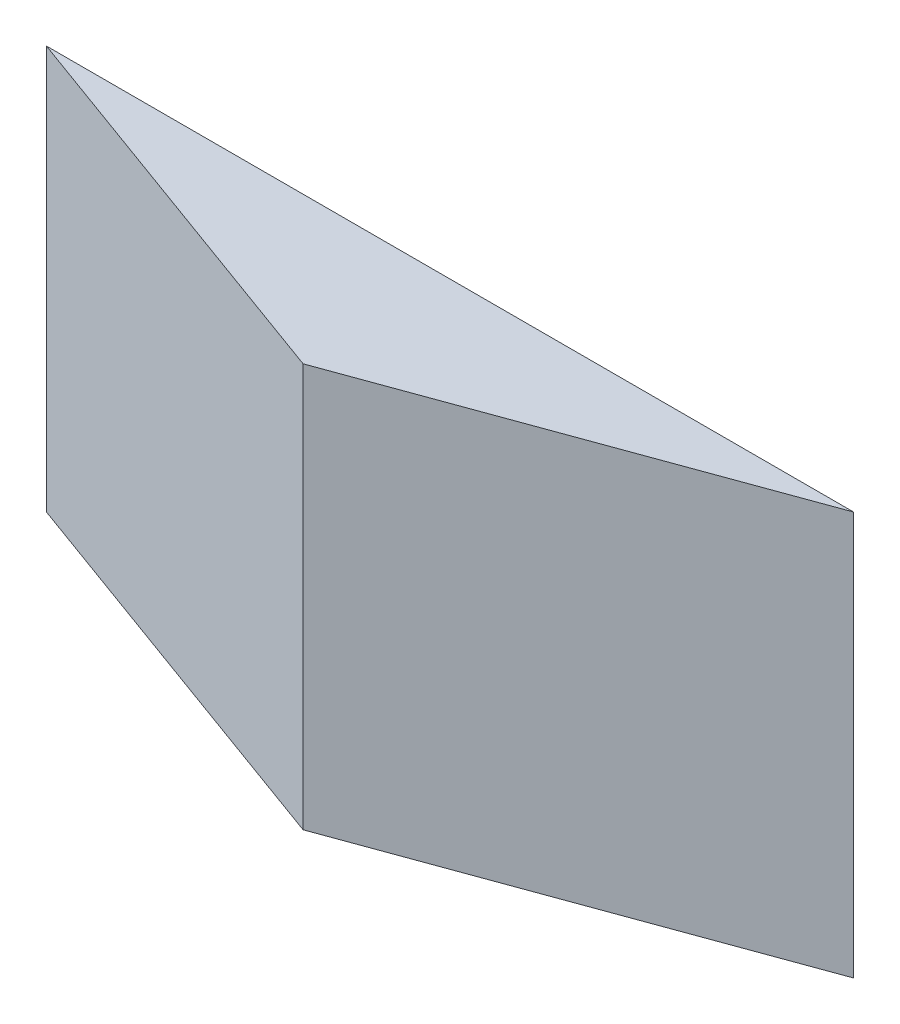
ISO-10303-21;
HEADER;
FILE_DESCRIPTION(('STEP AP214'),'2;1');
FILE_NAME('part.step','',(''),(''),'','','');
FILE_SCHEMA(('AUTOMOTIVE_DESIGN { 1 0 10303 214 1 1 1 1 }'));
ENDSEC;
DATA;
#1=APPLICATION_CONTEXT('core data for automotive mechanical design processes');
#2=APPLICATION_PROTOCOL_DEFINITION('international standard','automotive_design',2000,#1);
#3=PRODUCT_CONTEXT('',#1,'mechanical');
#4=PRODUCT('Part','Part','',(#3));
#5=PRODUCT_RELATED_PRODUCT_CATEGORY('part','',(#4));
#6=PRODUCT_DEFINITION_FORMATION('','',#4);
#7=PRODUCT_DEFINITION_CONTEXT('part definition',#1,'design');
#8=PRODUCT_DEFINITION('design','',#6,#7);
#9=PRODUCT_DEFINITION_SHAPE('','',#8);
#10=(LENGTH_UNIT() NAMED_UNIT(*) SI_UNIT(.MILLI.,.METRE.));
#11=(NAMED_UNIT(*) PLANE_ANGLE_UNIT() SI_UNIT($,.RADIAN.));
#12=(NAMED_UNIT(*) SI_UNIT($,.STERADIAN.) SOLID_ANGLE_UNIT());
#13=UNCERTAINTY_MEASURE_WITH_UNIT(LENGTH_MEASURE(1.E-05),#10,'distance_accuracy_value','');
#14=(GEOMETRIC_REPRESENTATION_CONTEXT(3) GLOBAL_UNCERTAINTY_ASSIGNED_CONTEXT((#13)) GLOBAL_UNIT_ASSIGNED_CONTEXT((#10,
#11,#12)) REPRESENTATION_CONTEXT('',''));
#15=CARTESIAN_POINT('',(0.,0.,0.));
#16=DIRECTION('',(0.,0.,1.));
#17=DIRECTION('',(1.,0.,0.));
#18=AXIS2_PLACEMENT_3D('',#15,#16,#17);
#19=CARTESIAN_POINT('',(20.,20.,0.));
#20=DIRECTION('',(-0.342020143325663,0.,-0.93969262078591));
#21=DIRECTION('',(-0.939692620785911,0.,0.342020143325663));
#22=AXIS2_PLACEMENT_3D('',#19,#20,#21);
#23=PLANE('',#22);
#24=DIRECTION('',(0.93969262078591,0.,-0.342020143325663));
#25=VECTOR('',#24,1.);
#26=CARTESIAN_POINT('',(20.,0.,0.));
#27=LINE('',#26,#25);
#28=CARTESIAN_POINT('',(0.,0.,7.27940468532391));
#29=VERTEX_POINT('',#28);
#30=CARTESIAN_POINT('',(20.,0.,0.));
#31=VERTEX_POINT('',#30);
#32=EDGE_CURVE('E89',#29,#31,#27,.T.);
#33=ORIENTED_EDGE('',*,*,#32,.T.);
#34=DIRECTION('',(0.,-1.,0.));
#35=VECTOR('',#34,1.);
#36=CARTESIAN_POINT('',(20.,20.,0.));
#37=LINE('',#36,#35);
#38=CARTESIAN_POINT('',(20.,20.,0.));
#39=VERTEX_POINT('',#38);
#40=EDGE_CURVE('E11',#39,#31,#37,.T.);
#41=ORIENTED_EDGE('',*,*,#40,.F.);
#42=DIRECTION('',(0.93969262078591,0.,-0.342020143325663));
#43=VECTOR('',#42,1.);
#44=CARTESIAN_POINT('',(20.,20.,0.));
#45=LINE('',#44,#43);
#46=CARTESIAN_POINT('',(0.,20.,7.27940468532391));
#47=VERTEX_POINT('',#46);
#48=EDGE_CURVE('E81',#47,#39,#45,.T.);
#49=ORIENTED_EDGE('',*,*,#48,.F.);
#50=DIRECTION('',(0.,-1.,0.));
#51=VECTOR('',#50,1.);
#52=CARTESIAN_POINT('',(0.,20.,7.27940468532391));
#53=LINE('',#52,#51);
#54=EDGE_CURVE('E90',#47,#29,#53,.T.);
#55=ORIENTED_EDGE('',*,*,#54,.T.);
#56=EDGE_LOOP('',(#33,#41,#49,#55));
#57=FACE_BOUND('',#56,.T.);
#58=ADVANCED_FACE('F39',(#57),#23,.F.);
#59=CARTESIAN_POINT('',(-20.,20.,0.));
#60=DIRECTION('',(0.,0.,1.));
#61=DIRECTION('',(1.,0.,0.));
#62=AXIS2_PLACEMENT_3D('',#59,#60,#61);
#63=PLANE('',#62);
#64=DIRECTION('',(-1.,0.,0.));
#65=VECTOR('',#64,1.);
#66=CARTESIAN_POINT('',(-20.,0.,0.));
#67=LINE('',#66,#65);
#68=CARTESIAN_POINT('',(-20.,0.,0.));
#69=VERTEX_POINT('',#68);
#70=EDGE_CURVE('E68',#31,#69,#67,.T.);
#71=ORIENTED_EDGE('',*,*,#70,.T.);
#72=DIRECTION('',(0.,-1.,0.));
#73=VECTOR('',#72,1.);
#74=CARTESIAN_POINT('',(-20.,20.,0.));
#75=LINE('',#74,#73);
#76=CARTESIAN_POINT('',(-20.,20.,0.));
#77=VERTEX_POINT('',#76);
#78=EDGE_CURVE('E48',#77,#69,#75,.T.);
#79=ORIENTED_EDGE('',*,*,#78,.F.);
#80=DIRECTION('',(-1.,0.,0.));
#81=VECTOR('',#80,1.);
#82=CARTESIAN_POINT('',(-20.,20.,0.));
#83=LINE('',#82,#81);
#84=EDGE_CURVE('E76',#39,#77,#83,.T.);
#85=ORIENTED_EDGE('',*,*,#84,.F.);
#86=ORIENTED_EDGE('',*,*,#40,.T.);
#87=EDGE_LOOP('',(#71,#79,#85,#86));
#88=FACE_BOUND('',#87,.T.);
#89=ADVANCED_FACE('F77',(#88),#63,.F.);
#90=CARTESIAN_POINT('',(-20.,20.,0.));
#91=DIRECTION('',(0.342020143325663,0.,-0.93969262078591));
#92=DIRECTION('',(-0.939692620785911,0.,-0.342020143325663));
#93=AXIS2_PLACEMENT_3D('',#90,#91,#92);
#94=PLANE('',#93);
#95=DIRECTION('',(0.93969262078591,0.,0.342020143325663));
#96=VECTOR('',#95,1.);
#97=CARTESIAN_POINT('',(-20.,0.,0.));
#98=LINE('',#97,#96);
#99=EDGE_CURVE('E73',#69,#29,#98,.T.);
#100=ORIENTED_EDGE('',*,*,#99,.T.);
#101=ORIENTED_EDGE('',*,*,#54,.F.);
#102=DIRECTION('',(0.93969262078591,0.,0.342020143325663));
#103=VECTOR('',#102,1.);
#104=CARTESIAN_POINT('',(-20.,20.,0.));
#105=LINE('',#104,#103);
#106=EDGE_CURVE('E56',#77,#47,#105,.T.);
#107=ORIENTED_EDGE('',*,*,#106,.F.);
#108=ORIENTED_EDGE('',*,*,#78,.T.);
#109=EDGE_LOOP('',(#100,#101,#107,#108));
#110=FACE_BOUND('',#109,.T.);
#111=ADVANCED_FACE('F102',(#110),#94,.F.);
#112=CARTESIAN_POINT('',(0.,20.,0.));
#113=DIRECTION('',(0.,1.,0.));
#114=DIRECTION('',(0.,0.,1.));
#115=AXIS2_PLACEMENT_3D('',#112,#113,#114);
#116=PLANE('',#115);
#117=ORIENTED_EDGE('',*,*,#48,.T.);
#118=ORIENTED_EDGE('',*,*,#84,.T.);
#119=ORIENTED_EDGE('',*,*,#106,.T.);
#120=EDGE_LOOP('',(#117,#118,#119));
#121=FACE_BOUND('',#120,.T.);
#122=ADVANCED_FACE('F84',(#121),#116,.T.);
#123=CARTESIAN_POINT('',(0.,0.,0.));
#124=DIRECTION('',(0.,1.,0.));
#125=DIRECTION('',(0.,0.,1.));
#126=AXIS2_PLACEMENT_3D('',#123,#124,#125);
#127=PLANE('',#126);
#128=ORIENTED_EDGE('',*,*,#32,.F.);
#129=ORIENTED_EDGE('',*,*,#99,.F.);
#130=ORIENTED_EDGE('',*,*,#70,.F.);
#131=EDGE_LOOP('',(#128,#129,#130));
#132=FACE_BOUND('',#131,.T.);
#133=ADVANCED_FACE('F103',(#132),#127,.F.);
#134=CLOSED_SHELL('',(#58,#89,#111,#122,#133));
#135=MANIFOLD_SOLID_BREP('B2',#134);
#136=ADVANCED_BREP_SHAPE_REPRESENTATION('',(#18,#135),#14);
#137=SHAPE_DEFINITION_REPRESENTATION(#9,#136);
ENDSEC;
END-ISO-10303-21;
